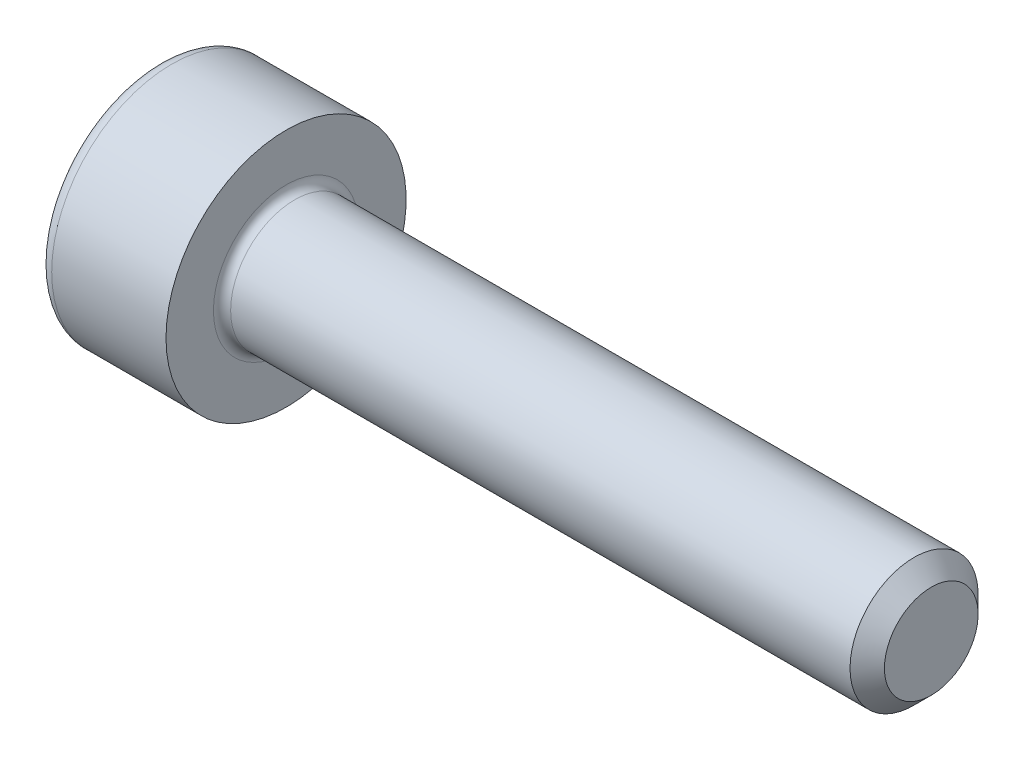
ISO-10303-21;
HEADER;
FILE_DESCRIPTION(('STEP AP214'),'2;1');
FILE_NAME('part.step','',(''),(''),'','','');
FILE_SCHEMA(('AUTOMOTIVE_DESIGN { 1 0 10303 214 1 1 1 1 }'));
ENDSEC;
DATA;
#1=APPLICATION_CONTEXT('core data for automotive mechanical design processes');
#2=APPLICATION_PROTOCOL_DEFINITION('international standard','automotive_design',2000,#1);
#3=PRODUCT_CONTEXT('',#1,'mechanical');
#4=PRODUCT('Part','Part','',(#3));
#5=PRODUCT_RELATED_PRODUCT_CATEGORY('part','',(#4));
#6=PRODUCT_DEFINITION_FORMATION('','',#4);
#7=PRODUCT_DEFINITION_CONTEXT('part definition',#1,'design');
#8=PRODUCT_DEFINITION('design','',#6,#7);
#9=PRODUCT_DEFINITION_SHAPE('','',#8);
#10=(LENGTH_UNIT() NAMED_UNIT(*) SI_UNIT(.MILLI.,.METRE.));
#11=(NAMED_UNIT(*) PLANE_ANGLE_UNIT() SI_UNIT($,.RADIAN.));
#12=(NAMED_UNIT(*) SI_UNIT($,.STERADIAN.) SOLID_ANGLE_UNIT());
#13=UNCERTAINTY_MEASURE_WITH_UNIT(LENGTH_MEASURE(1.E-05),#10,'distance_accuracy_value','');
#14=(GEOMETRIC_REPRESENTATION_CONTEXT(3) GLOBAL_UNCERTAINTY_ASSIGNED_CONTEXT((#13)) GLOBAL_UNIT_ASSIGNED_CONTEXT((#10,
#11,#12)) REPRESENTATION_CONTEXT('',''));
#15=CARTESIAN_POINT('',(0.,0.,0.));
#16=DIRECTION('',(0.,0.,1.));
#17=DIRECTION('',(1.,0.,0.));
#18=AXIS2_PLACEMENT_3D('',#15,#16,#17);
#19=CARTESIAN_POINT('',(0.,0.,0.));
#20=DIRECTION('',(-1.,0.,0.));
#21=DIRECTION('',(0.,0.,1.));
#22=AXIS2_PLACEMENT_3D('',#19,#20,#21);
#23=CYLINDRICAL_SURFACE('',#22,1.39568824458778);
#24=CARTESIAN_POINT('',(0.16,0.,0.));
#25=DIRECTION('',(1.,0.,0.));
#26=DIRECTION('',(0.,0.,-1.));
#27=AXIS2_PLACEMENT_3D('',#24,#25,#26);
#28=CIRCLE('',#27,1.39568824458778);
#29=CARTESIAN_POINT('',(0.16,0.,-1.39568824458778));
#30=VERTEX_POINT('',#29);
#31=EDGE_CURVE('E158',#30,#30,#28,.T.);
#32=ORIENTED_EDGE('',*,*,#31,.T.);
#33=EDGE_LOOP('',(#32));
#34=FACE_BOUND('',#33,.T.);
#35=CARTESIAN_POINT('',(1.48873412756029,0.,0.));
#36=DIRECTION('',(-1.,0.,0.));
#37=DIRECTION('',(0.,0.,1.));
#38=AXIS2_PLACEMENT_3D('',#35,#36,#37);
#39=CIRCLE('',#38,1.39568824458778);
#40=CARTESIAN_POINT('',(1.48873412756029,0.,1.39568824458778));
#41=VERTEX_POINT('',#40);
#42=EDGE_CURVE('E141',#41,#41,#39,.T.);
#43=ORIENTED_EDGE('',*,*,#42,.T.);
#44=EDGE_LOOP('',(#43));
#45=FACE_BOUND('',#44,.T.);
#46=ADVANCED_FACE('F39',(#34,#45),#23,.T.);
#47=CARTESIAN_POINT('',(0.,0.,0.));
#48=DIRECTION('',(1.,0.,0.));
#49=DIRECTION('',(0.,0.,-1.));
#50=AXIS2_PLACEMENT_3D('',#47,#48,#49);
#51=PLANE('',#50);
#52=DIRECTION('',(0.,-0.5,-0.866025403784439));
#53=VECTOR('',#52,1.);
#54=CARTESIAN_POINT('',(0.,0.877572409168232,0.));
#55=LINE('',#54,#53);
#56=CARTESIAN_POINT('',(0.,0.877572409168232,0.));
#57=VERTEX_POINT('',#56);
#58=CARTESIAN_POINT('',(0.,0.438786204584116,-0.760000000000001));
#59=VERTEX_POINT('',#58);
#60=EDGE_CURVE('E128',#57,#59,#55,.T.);
#61=ORIENTED_EDGE('',*,*,#60,.F.);
#62=DIRECTION('',(0.,0.5,-0.866025403784439));
#63=VECTOR('',#62,1.);
#64=CARTESIAN_POINT('',(0.,0.438786204584116,0.76));
#65=LINE('',#64,#63);
#66=CARTESIAN_POINT('',(0.,0.438786204584116,0.76));
#67=VERTEX_POINT('',#66);
#68=EDGE_CURVE('E54',#67,#57,#65,.T.);
#69=ORIENTED_EDGE('',*,*,#68,.F.);
#70=DIRECTION('',(0.,1.,0.));
#71=VECTOR('',#70,1.);
#72=CARTESIAN_POINT('',(0.,-0.438786204584116,0.76));
#73=LINE('',#72,#71);
#74=CARTESIAN_POINT('',(0.,-0.438786204584116,0.76));
#75=VERTEX_POINT('',#74);
#76=EDGE_CURVE('E137',#75,#67,#73,.T.);
#77=ORIENTED_EDGE('',*,*,#76,.F.);
#78=DIRECTION('',(0.,0.5,0.866025403784439));
#79=VECTOR('',#78,1.);
#80=CARTESIAN_POINT('',(0.,-0.877572409168232,0.));
#81=LINE('',#80,#79);
#82=CARTESIAN_POINT('',(0.,-0.877572409168232,0.));
#83=VERTEX_POINT('',#82);
#84=EDGE_CURVE('E135',#83,#75,#81,.T.);
#85=ORIENTED_EDGE('',*,*,#84,.F.);
#86=DIRECTION('',(0.,-0.5,0.866025403784438));
#87=VECTOR('',#86,1.);
#88=CARTESIAN_POINT('',(0.,-0.438786204584116,-0.760000000000001));
#89=LINE('',#88,#87);
#90=CARTESIAN_POINT('',(0.,-0.438786204584116,-0.760000000000001));
#91=VERTEX_POINT('',#90);
#92=EDGE_CURVE('E102',#91,#83,#89,.T.);
#93=ORIENTED_EDGE('',*,*,#92,.F.);
#94=DIRECTION('',(0.,-1.,0.));
#95=VECTOR('',#94,1.);
#96=CARTESIAN_POINT('',(0.,0.438786204584116,-0.760000000000001));
#97=LINE('',#96,#95);
#98=EDGE_CURVE('E131',#59,#91,#97,.T.);
#99=ORIENTED_EDGE('',*,*,#98,.F.);
#100=EDGE_LOOP('',(#61,#69,#77,#85,#93,#99));
#101=FACE_BOUND('',#100,.T.);
#102=CARTESIAN_POINT('',(0.,0.,0.));
#103=DIRECTION('',(1.,0.,0.));
#104=DIRECTION('',(0.,0.,-1.));
#105=AXIS2_PLACEMENT_3D('',#102,#103,#104);
#106=CIRCLE('',#105,1.23568824458778);
#107=CARTESIAN_POINT('',(0.,0.,-1.23568824458778));
#108=VERTEX_POINT('',#107);
#109=EDGE_CURVE('E155',#108,#108,#106,.F.);
#110=ORIENTED_EDGE('',*,*,#109,.T.);
#111=EDGE_LOOP('',(#110));
#112=FACE_BOUND('',#111,.T.);
#113=ADVANCED_FACE('F180',(#101,#112),#51,.F.);
#114=CARTESIAN_POINT('',(8.98873412756029,0.,0.));
#115=DIRECTION('',(-1.,0.,0.));
#116=DIRECTION('',(0.,0.,1.));
#117=AXIS2_PLACEMENT_3D('',#114,#115,#116);
#118=PLANE('',#117);
#119=CARTESIAN_POINT('',(8.98873412756029,0.,0.));
#120=DIRECTION('',(-1.,0.,0.));
#121=DIRECTION('',(0.,0.,1.));
#122=AXIS2_PLACEMENT_3D('',#119,#120,#121);
#123=CIRCLE('',#122,0.544367063780144);
#124=CARTESIAN_POINT('',(8.98873412756029,0.,0.544367063780144));
#125=VERTEX_POINT('',#124);
#126=EDGE_CURVE('E11',#125,#125,#123,.F.);
#127=ORIENTED_EDGE('',*,*,#126,.T.);
#128=EDGE_LOOP('',(#127));
#129=FACE_BOUND('',#128,.T.);
#130=ADVANCED_FACE('F186',(#129),#118,.F.);
#131=CARTESIAN_POINT('',(0.,0.,0.));
#132=DIRECTION('',(-1.,0.,0.));
#133=DIRECTION('',(0.,0.,1.));
#134=AXIS2_PLACEMENT_3D('',#131,#132,#133);
#135=CYLINDRICAL_SURFACE('',#134,0.744367063780147);
#136=CARTESIAN_POINT('',(8.78873412756029,0.,0.));
#137=DIRECTION('',(-1.,0.,0.));
#138=DIRECTION('',(0.,0.,1.));
#139=AXIS2_PLACEMENT_3D('',#136,#137,#138);
#140=CIRCLE('',#139,0.744367063780147);
#141=CARTESIAN_POINT('',(8.78873412756029,0.,0.744367063780147));
#142=VERTEX_POINT('',#141);
#143=EDGE_CURVE('E47',#142,#142,#140,.T.);
#144=ORIENTED_EDGE('',*,*,#143,.T.);
#145=EDGE_LOOP('',(#144));
#146=FACE_BOUND('',#145,.T.);
#147=CARTESIAN_POINT('',(1.58873412756029,0.,0.));
#148=DIRECTION('',(-1.,0.,0.));
#149=DIRECTION('',(0.,0.,1.));
#150=AXIS2_PLACEMENT_3D('',#147,#148,#149);
#151=CIRCLE('',#150,0.744367063780147);
#152=CARTESIAN_POINT('',(1.58873412756029,0.,0.744367063780147));
#153=VERTEX_POINT('',#152);
#154=EDGE_CURVE('E152',#153,#153,#151,.F.);
#155=ORIENTED_EDGE('',*,*,#154,.T.);
#156=EDGE_LOOP('',(#155));
#157=FACE_BOUND('',#156,.T.);
#158=ADVANCED_FACE('F163',(#146,#157),#135,.T.);
#159=CARTESIAN_POINT('',(1.48873412756029,0.,0.));
#160=DIRECTION('',(-1.,0.,0.));
#161=DIRECTION('',(0.,0.,1.));
#162=AXIS2_PLACEMENT_3D('',#159,#160,#161);
#163=PLANE('',#162);
#164=CARTESIAN_POINT('',(1.48873412756029,0.,0.));
#165=DIRECTION('',(-1.,0.,0.));
#166=DIRECTION('',(0.,0.,1.));
#167=AXIS2_PLACEMENT_3D('',#164,#165,#166);
#168=CIRCLE('',#167,0.844367063780147);
#169=CARTESIAN_POINT('',(1.48873412756029,0.,0.844367063780147));
#170=VERTEX_POINT('',#169);
#171=EDGE_CURVE('E149',#170,#170,#168,.T.);
#172=ORIENTED_EDGE('',*,*,#171,.T.);
#173=EDGE_LOOP('',(#172));
#174=FACE_BOUND('',#173,.T.);
#175=ORIENTED_EDGE('',*,*,#42,.F.);
#176=EDGE_LOOP('',(#175));
#177=FACE_BOUND('',#176,.T.);
#178=ADVANCED_FACE('F193',(#174,#177),#163,.F.);
#179=CARTESIAN_POINT('',(1.58873412756029,0.,0.));
#180=DIRECTION('',(-1.,0.,0.));
#181=DIRECTION('',(0.,0.,1.));
#182=AXIS2_PLACEMENT_3D('',#179,#180,#181);
#183=TOROIDAL_SURFACE('',#182,0.844367063780147,0.1);
#184=ORIENTED_EDGE('',*,*,#154,.F.);
#185=EDGE_LOOP('',(#184));
#186=FACE_BOUND('',#185,.T.);
#187=ORIENTED_EDGE('',*,*,#171,.F.);
#188=EDGE_LOOP('',(#187));
#189=FACE_BOUND('',#188,.T.);
#190=ADVANCED_FACE('F176',(#186,#189),#183,.F.);
#191=CARTESIAN_POINT('',(0.16,0.,0.));
#192=DIRECTION('',(1.,0.,0.));
#193=DIRECTION('',(0.,0.,-1.));
#194=AXIS2_PLACEMENT_3D('',#191,#192,#193);
#195=TOROIDAL_SURFACE('',#194,1.23568824458778,0.16);
#196=ORIENTED_EDGE('',*,*,#31,.F.);
#197=EDGE_LOOP('',(#196));
#198=FACE_BOUND('',#197,.T.);
#199=ORIENTED_EDGE('',*,*,#109,.F.);
#200=EDGE_LOOP('',(#199));
#201=FACE_BOUND('',#200,.T.);
#202=ADVANCED_FACE('F168',(#198,#201),#195,.T.);
#203=CARTESIAN_POINT('',(8.78873412756029,0.,0.));
#204=DIRECTION('',(-1.,0.,0.));
#205=DIRECTION('',(0.,0.,1.));
#206=AXIS2_PLACEMENT_3D('',#203,#204,#205);
#207=CONICAL_SURFACE('',#206,0.744367063780147,0.785398163397445);
#208=ORIENTED_EDGE('',*,*,#126,.F.);
#209=EDGE_LOOP('',(#208));
#210=FACE_BOUND('',#209,.T.);
#211=ORIENTED_EDGE('',*,*,#143,.F.);
#212=EDGE_LOOP('',(#211));
#213=FACE_BOUND('',#212,.T.);
#214=ADVANCED_FACE('F41',(#210,#213),#207,.T.);
#215=CARTESIAN_POINT('',(0.7,0.438786204584116,0.76));
#216=DIRECTION('',(0.,0.866025403784439,0.5));
#217=DIRECTION('',(0.,-0.5,0.866025403784439));
#218=AXIS2_PLACEMENT_3D('',#215,#216,#217);
#219=PLANE('',#218);
#220=ORIENTED_EDGE('',*,*,#68,.T.);
#221=DIRECTION('',(-1.,0.,0.));
#222=VECTOR('',#221,1.);
#223=CARTESIAN_POINT('',(0.7,0.877572409168232,0.));
#224=LINE('',#223,#222);
#225=CARTESIAN_POINT('',(0.7,0.877572409168232,0.));
#226=VERTEX_POINT('',#225);
#227=EDGE_CURVE('E84',#226,#57,#224,.T.);
#228=ORIENTED_EDGE('',*,*,#227,.F.);
#229=DIRECTION('',(0.,0.5,-0.866025403784439));
#230=VECTOR('',#229,1.);
#231=CARTESIAN_POINT('',(0.7,0.438786204584116,0.76));
#232=LINE('',#231,#230);
#233=CARTESIAN_POINT('',(0.7,0.438786204584116,0.76));
#234=VERTEX_POINT('',#233);
#235=EDGE_CURVE('E139',#234,#226,#232,.T.);
#236=ORIENTED_EDGE('',*,*,#235,.F.);
#237=DIRECTION('',(-1.,0.,0.));
#238=VECTOR('',#237,1.);
#239=CARTESIAN_POINT('',(0.7,0.438786204584116,0.76));
#240=LINE('',#239,#238);
#241=EDGE_CURVE('E62',#234,#67,#240,.T.);
#242=ORIENTED_EDGE('',*,*,#241,.T.);
#243=EDGE_LOOP('',(#220,#228,#236,#242));
#244=FACE_BOUND('',#243,.T.);
#245=ADVANCED_FACE('F167',(#244),#219,.F.);
#246=CARTESIAN_POINT('',(0.7,-0.438786204584116,0.76));
#247=DIRECTION('',(0.,0.,1.));
#248=DIRECTION('',(1.,0.,0.));
#249=AXIS2_PLACEMENT_3D('',#246,#247,#248);
#250=PLANE('',#249);
#251=ORIENTED_EDGE('',*,*,#76,.T.);
#252=ORIENTED_EDGE('',*,*,#241,.F.);
#253=DIRECTION('',(0.,1.,0.));
#254=VECTOR('',#253,1.);
#255=CARTESIAN_POINT('',(0.7,-0.438786204584116,0.76));
#256=LINE('',#255,#254);
#257=CARTESIAN_POINT('',(0.7,-0.438786204584116,0.76));
#258=VERTEX_POINT('',#257);
#259=EDGE_CURVE('E114',#258,#234,#256,.T.);
#260=ORIENTED_EDGE('',*,*,#259,.F.);
#261=DIRECTION('',(-1.,0.,0.));
#262=VECTOR('',#261,1.);
#263=CARTESIAN_POINT('',(0.7,-0.438786204584116,0.76));
#264=LINE('',#263,#262);
#265=EDGE_CURVE('E106',#258,#75,#264,.T.);
#266=ORIENTED_EDGE('',*,*,#265,.T.);
#267=EDGE_LOOP('',(#251,#252,#260,#266));
#268=FACE_BOUND('',#267,.T.);
#269=ADVANCED_FACE('F174',(#268),#250,.F.);
#270=CARTESIAN_POINT('',(0.7,-0.877572409168232,0.));
#271=DIRECTION('',(0.,-0.866025403784439,0.5));
#272=DIRECTION('',(0.,-0.5,-0.866025403784439));
#273=AXIS2_PLACEMENT_3D('',#270,#271,#272);
#274=PLANE('',#273);
#275=ORIENTED_EDGE('',*,*,#84,.T.);
#276=ORIENTED_EDGE('',*,*,#265,.F.);
#277=DIRECTION('',(0.,0.5,0.866025403784439));
#278=VECTOR('',#277,1.);
#279=CARTESIAN_POINT('',(0.7,-0.877572409168232,0.));
#280=LINE('',#279,#278);
#281=CARTESIAN_POINT('',(0.7,-0.877572409168232,0.));
#282=VERTEX_POINT('',#281);
#283=EDGE_CURVE('E110',#282,#258,#280,.T.);
#284=ORIENTED_EDGE('',*,*,#283,.F.);
#285=DIRECTION('',(-1.,0.,0.));
#286=VECTOR('',#285,1.);
#287=CARTESIAN_POINT('',(0.7,-0.877572409168232,0.));
#288=LINE('',#287,#286);
#289=EDGE_CURVE('E95',#282,#83,#288,.T.);
#290=ORIENTED_EDGE('',*,*,#289,.T.);
#291=EDGE_LOOP('',(#275,#276,#284,#290));
#292=FACE_BOUND('',#291,.T.);
#293=ADVANCED_FACE('F111',(#292),#274,.F.);
#294=CARTESIAN_POINT('',(0.7,-0.438786204584116,-0.760000000000001));
#295=DIRECTION('',(0.,-0.866025403784438,-0.5));
#296=DIRECTION('',(0.,0.5,-0.866025403784438));
#297=AXIS2_PLACEMENT_3D('',#294,#295,#296);
#298=PLANE('',#297);
#299=ORIENTED_EDGE('',*,*,#92,.T.);
#300=ORIENTED_EDGE('',*,*,#289,.F.);
#301=DIRECTION('',(0.,-0.5,0.866025403784438));
#302=VECTOR('',#301,1.);
#303=CARTESIAN_POINT('',(0.7,-0.438786204584116,-0.760000000000001));
#304=LINE('',#303,#302);
#305=CARTESIAN_POINT('',(0.7,-0.438786204584116,-0.760000000000001));
#306=VERTEX_POINT('',#305);
#307=EDGE_CURVE('E99',#306,#282,#304,.T.);
#308=ORIENTED_EDGE('',*,*,#307,.F.);
#309=DIRECTION('',(-1.,0.,0.));
#310=VECTOR('',#309,1.);
#311=CARTESIAN_POINT('',(0.7,-0.438786204584116,-0.760000000000001));
#312=LINE('',#311,#310);
#313=EDGE_CURVE('E107',#306,#91,#312,.T.);
#314=ORIENTED_EDGE('',*,*,#313,.T.);
#315=EDGE_LOOP('',(#299,#300,#308,#314));
#316=FACE_BOUND('',#315,.T.);
#317=ADVANCED_FACE('F97',(#316),#298,.F.);
#318=CARTESIAN_POINT('',(0.7,0.438786204584116,-0.760000000000001));
#319=DIRECTION('',(0.,0.,-1.));
#320=DIRECTION('',(0.,1.,0.));
#321=AXIS2_PLACEMENT_3D('',#318,#319,#320);
#322=PLANE('',#321);
#323=ORIENTED_EDGE('',*,*,#98,.T.);
#324=ORIENTED_EDGE('',*,*,#313,.F.);
#325=DIRECTION('',(0.,-1.,0.));
#326=VECTOR('',#325,1.);
#327=CARTESIAN_POINT('',(0.7,0.438786204584116,-0.760000000000001));
#328=LINE('',#327,#326);
#329=CARTESIAN_POINT('',(0.7,0.438786204584116,-0.760000000000001));
#330=VERTEX_POINT('',#329);
#331=EDGE_CURVE('E120',#330,#306,#328,.T.);
#332=ORIENTED_EDGE('',*,*,#331,.F.);
#333=DIRECTION('',(-1.,0.,0.));
#334=VECTOR('',#333,1.);
#335=CARTESIAN_POINT('',(0.7,0.438786204584116,-0.760000000000001));
#336=LINE('',#335,#334);
#337=EDGE_CURVE('E144',#330,#59,#336,.T.);
#338=ORIENTED_EDGE('',*,*,#337,.T.);
#339=EDGE_LOOP('',(#323,#324,#332,#338));
#340=FACE_BOUND('',#339,.T.);
#341=ADVANCED_FACE('F215',(#340),#322,.F.);
#342=CARTESIAN_POINT('',(0.7,0.877572409168232,0.));
#343=DIRECTION('',(0.,0.866025403784439,-0.5));
#344=DIRECTION('',(0.,0.5,0.866025403784439));
#345=AXIS2_PLACEMENT_3D('',#342,#343,#344);
#346=PLANE('',#345);
#347=ORIENTED_EDGE('',*,*,#60,.T.);
#348=ORIENTED_EDGE('',*,*,#337,.F.);
#349=DIRECTION('',(0.,-0.5,-0.866025403784439));
#350=VECTOR('',#349,1.);
#351=CARTESIAN_POINT('',(0.7,0.877572409168232,0.));
#352=LINE('',#351,#350);
#353=EDGE_CURVE('E122',#226,#330,#352,.T.);
#354=ORIENTED_EDGE('',*,*,#353,.F.);
#355=ORIENTED_EDGE('',*,*,#227,.T.);
#356=EDGE_LOOP('',(#347,#348,#354,#355));
#357=FACE_BOUND('',#356,.T.);
#358=ADVANCED_FACE('F212',(#357),#346,.F.);
#359=CARTESIAN_POINT('',(0.7,0.,0.));
#360=DIRECTION('',(-1.,0.,0.));
#361=DIRECTION('',(0.,0.,1.));
#362=AXIS2_PLACEMENT_3D('',#359,#360,#361);
#363=PLANE('',#362);
#364=ORIENTED_EDGE('',*,*,#235,.T.);
#365=ORIENTED_EDGE('',*,*,#353,.T.);
#366=ORIENTED_EDGE('',*,*,#331,.T.);
#367=ORIENTED_EDGE('',*,*,#307,.T.);
#368=ORIENTED_EDGE('',*,*,#283,.T.);
#369=ORIENTED_EDGE('',*,*,#259,.T.);
#370=EDGE_LOOP('',(#364,#365,#366,#367,#368,#369));
#371=FACE_BOUND('',#370,.T.);
#372=ADVANCED_FACE('F117',(#371),#363,.T.);
#373=CLOSED_SHELL('',(#46,#113,#130,#158,#178,#190,#202,#214,#245,#269,#293,#317,#341,#358,#372));
#374=MANIFOLD_SOLID_BREP('B2',#373);
#375=ADVANCED_BREP_SHAPE_REPRESENTATION('',(#18,#374),#14);
#376=SHAPE_DEFINITION_REPRESENTATION(#9,#375);
ENDSEC;
END-ISO-10303-21;
